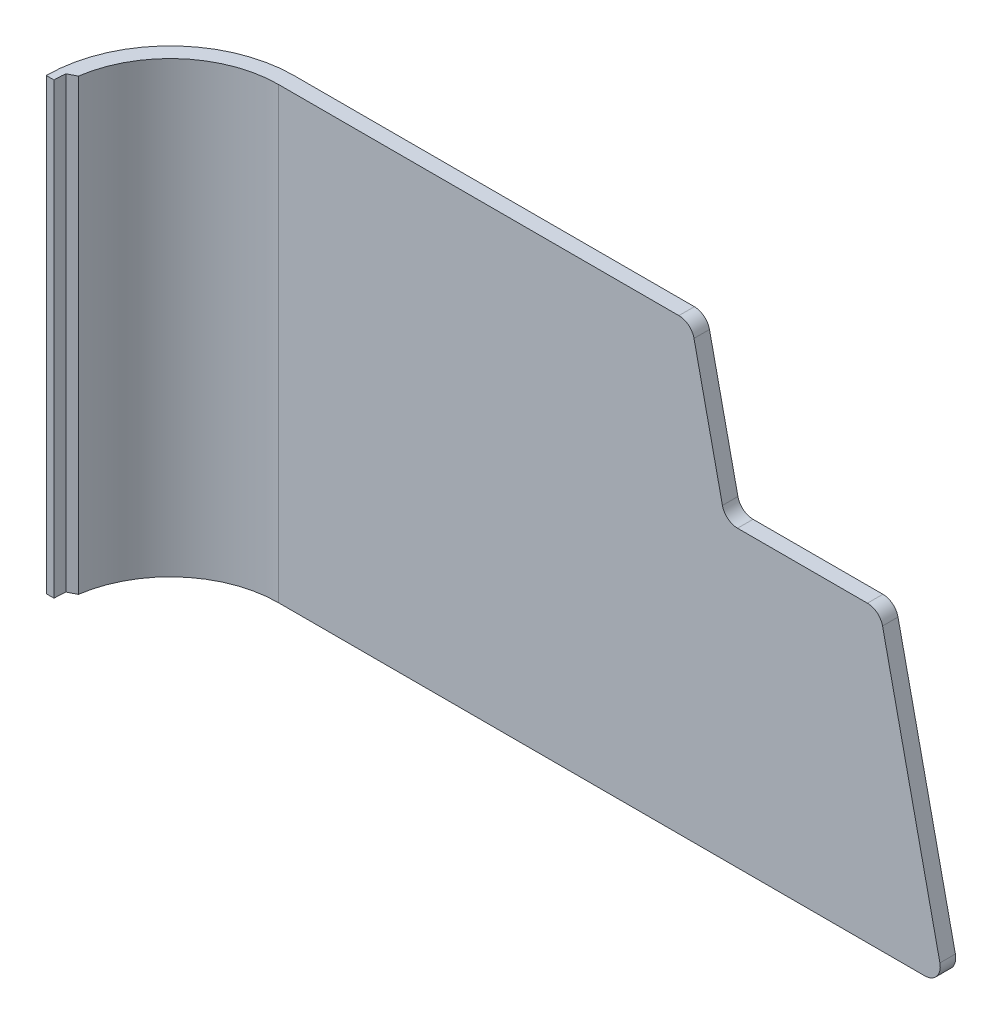
ISO-10303-21;
HEADER;
FILE_DESCRIPTION(('STEP AP214'),'2;1');
FILE_NAME('part.step','',(''),(''),'','','');
FILE_SCHEMA(('AUTOMOTIVE_DESIGN { 1 0 10303 214 1 1 1 1 }'));
ENDSEC;
DATA;
#1=APPLICATION_CONTEXT('core data for automotive mechanical design processes');
#2=APPLICATION_PROTOCOL_DEFINITION('international standard','automotive_design',2000,#1);
#3=PRODUCT_CONTEXT('',#1,'mechanical');
#4=PRODUCT('Part','Part','',(#3));
#5=PRODUCT_RELATED_PRODUCT_CATEGORY('part','',(#4));
#6=PRODUCT_DEFINITION_FORMATION('','',#4);
#7=PRODUCT_DEFINITION_CONTEXT('part definition',#1,'design');
#8=PRODUCT_DEFINITION('design','',#6,#7);
#9=PRODUCT_DEFINITION_SHAPE('','',#8);
#10=(LENGTH_UNIT() NAMED_UNIT(*) SI_UNIT(.MILLI.,.METRE.));
#11=(NAMED_UNIT(*) PLANE_ANGLE_UNIT() SI_UNIT($,.RADIAN.));
#12=(NAMED_UNIT(*) SI_UNIT($,.STERADIAN.) SOLID_ANGLE_UNIT());
#13=UNCERTAINTY_MEASURE_WITH_UNIT(LENGTH_MEASURE(1.E-05),#10,'distance_accuracy_value','');
#14=(GEOMETRIC_REPRESENTATION_CONTEXT(3) GLOBAL_UNCERTAINTY_ASSIGNED_CONTEXT((#13)) GLOBAL_UNIT_ASSIGNED_CONTEXT((#10,
#11,#12)) REPRESENTATION_CONTEXT('',''));
#15=CARTESIAN_POINT('',(0.,0.,0.));
#16=DIRECTION('',(0.,0.,1.));
#17=DIRECTION('',(1.,0.,0.));
#18=AXIS2_PLACEMENT_3D('',#15,#16,#17);
#19=CARTESIAN_POINT('',(-50.,58.,-16.));
#20=DIRECTION('',(0.,0.,-1.));
#21=DIRECTION('',(-1.,0.,0.));
#22=AXIS2_PLACEMENT_3D('',#19,#20,#21);
#23=PLANE('',#22);
#24=DIRECTION('',(-0.213030386274981,0.977045574435263,0.));
#25=VECTOR('',#24,1.);
#26=CARTESIAN_POINT('',(34.3662499628471,7.49305426068737,-16.));
#27=LINE('',#26,#25);
#28=CARTESIAN_POINT('',(35.4710332076355,2.42606077254996,-16.));
#29=VERTEX_POINT('',#28);
#30=CARTESIAN_POINT('',(28.0578343529804,36.42606077255,-16.));
#31=VERTEX_POINT('',#30);
#32=EDGE_CURVE('E180',#29,#31,#27,.T.);
#33=ORIENTED_EDGE('',*,*,#32,.F.);
#34=CARTESIAN_POINT('',(33.516942058765,2.,-16.));
#35=DIRECTION('',(0.,0.,-1.));
#36=DIRECTION('',(-1.,0.,0.));
#37=AXIS2_PLACEMENT_3D('',#34,#35,#36);
#38=CIRCLE('',#37,2.);
#39=CARTESIAN_POINT('',(33.516942058765,0.,-16.));
#40=VERTEX_POINT('',#39);
#41=EDGE_CURVE('E221',#29,#40,#38,.T.);
#42=ORIENTED_EDGE('',*,*,#41,.T.);
#43=DIRECTION('',(1.,0.,0.));
#44=VECTOR('',#43,1.);
#45=CARTESIAN_POINT('',(-50.,0.,-16.));
#46=LINE('',#45,#44);
#47=CARTESIAN_POINT('',(-50.,0.,-16.));
#48=VERTEX_POINT('',#47);
#49=EDGE_CURVE('E176',#48,#40,#46,.T.);
#50=ORIENTED_EDGE('',*,*,#49,.F.);
#51=DIRECTION('',(0.,-1.,0.));
#52=VECTOR('',#51,1.);
#53=CARTESIAN_POINT('',(-50.,58.,-16.));
#54=LINE('',#53,#52);
#55=CARTESIAN_POINT('',(-50.,58.,-16.));
#56=VERTEX_POINT('',#55);
#57=EDGE_CURVE('E194',#56,#48,#54,.T.);
#58=ORIENTED_EDGE('',*,*,#57,.F.);
#59=DIRECTION('',(1.,0.,0.));
#60=VECTOR('',#59,1.);
#61=CARTESIAN_POINT('',(-50.,58.,-16.));
#62=LINE('',#61,#60);
#63=CARTESIAN_POINT('',(1.74303799548921,58.,-16.));
#64=VERTEX_POINT('',#63);
#65=EDGE_CURVE('E159',#56,#64,#62,.T.);
#66=ORIENTED_EDGE('',*,*,#65,.T.);
#67=CARTESIAN_POINT('',(1.74303799548922,56.,-16.));
#68=DIRECTION('',(0.,0.,-1.));
#69=DIRECTION('',(-1.,0.,0.));
#70=AXIS2_PLACEMENT_3D('',#67,#68,#69);
#71=CIRCLE('',#70,2.);
#72=CARTESIAN_POINT('',(3.69712914435974,56.42606077255,-16.));
#73=VERTEX_POINT('',#72);
#74=EDGE_CURVE('E217',#64,#73,#71,.T.);
#75=ORIENTED_EDGE('',*,*,#74,.T.);
#76=DIRECTION('',(-0.213030386274981,0.977045574435263,0.));
#77=VECTOR('',#76,1.);
#78=CARTESIAN_POINT('',(15.2738888723765,3.33024633808327,-16.));
#79=LINE('',#78,#77);
#80=CARTESIAN_POINT('',(7.37148585426103,39.5739392274501,-16.));
#81=VERTEX_POINT('',#80);
#82=EDGE_CURVE('E249',#81,#73,#79,.T.);
#83=ORIENTED_EDGE('',*,*,#82,.F.);
#84=CARTESIAN_POINT('',(9.32557700313156,40.,-16.));
#85=DIRECTION('',(0.,0.,-1.));
#86=DIRECTION('',(-1.,0.,0.));
#87=AXIS2_PLACEMENT_3D('',#84,#85,#86);
#88=CIRCLE('',#87,2.);
#89=CARTESIAN_POINT('',(9.32557700313156,38.,-16.));
#90=VERTEX_POINT('',#89);
#91=EDGE_CURVE('E11',#81,#90,#88,.F.);
#92=ORIENTED_EDGE('',*,*,#91,.T.);
#93=DIRECTION('',(-1.,0.,0.));
#94=VECTOR('',#93,1.);
#95=CARTESIAN_POINT('',(0.,38.,-16.));
#96=LINE('',#95,#94);
#97=CARTESIAN_POINT('',(26.1037432041099,38.,-16.));
#98=VERTEX_POINT('',#97);
#99=EDGE_CURVE('E247',#98,#90,#96,.T.);
#100=ORIENTED_EDGE('',*,*,#99,.F.);
#101=CARTESIAN_POINT('',(26.1037432041099,36.,-16.));
#102=DIRECTION('',(0.,0.,-1.));
#103=DIRECTION('',(-1.,0.,0.));
#104=AXIS2_PLACEMENT_3D('',#101,#102,#103);
#105=CIRCLE('',#104,2.);
#106=EDGE_CURVE('E219',#98,#31,#105,.T.);
#107=ORIENTED_EDGE('',*,*,#106,.T.);
#108=EDGE_LOOP('',(#33,#42,#50,#58,#66,#75,#83,#92,#100,#107));
#109=FACE_BOUND('',#108,.T.);
#110=ADVANCED_FACE('F38',(#109),#23,.T.);
#111=CARTESIAN_POINT('',(-50.,58.,-14.));
#112=DIRECTION('',(0.,0.,-1.));
#113=DIRECTION('',(-1.,0.,0.));
#114=AXIS2_PLACEMENT_3D('',#111,#112,#113);
#115=PLANE('',#114);
#116=DIRECTION('',(1.,0.,0.));
#117=VECTOR('',#116,1.);
#118=CARTESIAN_POINT('',(-50.,0.,-14.));
#119=LINE('',#118,#117);
#120=CARTESIAN_POINT('',(-50.,0.,-14.));
#121=VERTEX_POINT('',#120);
#122=CARTESIAN_POINT('',(33.516942058765,0.,-14.));
#123=VERTEX_POINT('',#122);
#124=EDGE_CURVE('E179',#121,#123,#119,.T.);
#125=ORIENTED_EDGE('',*,*,#124,.T.);
#126=CARTESIAN_POINT('',(33.516942058765,2.,-14.));
#127=DIRECTION('',(0.,0.,-1.));
#128=DIRECTION('',(-1.,0.,0.));
#129=AXIS2_PLACEMENT_3D('',#126,#127,#128);
#130=CIRCLE('',#129,2.);
#131=CARTESIAN_POINT('',(35.4710332076355,2.42606077254996,-14.));
#132=VERTEX_POINT('',#131);
#133=EDGE_CURVE('E210',#123,#132,#130,.F.);
#134=ORIENTED_EDGE('',*,*,#133,.T.);
#135=DIRECTION('',(-0.213030386274981,0.977045574435263,0.));
#136=VECTOR('',#135,1.);
#137=CARTESIAN_POINT('',(34.3662499628471,7.49305426068737,-14.));
#138=LINE('',#137,#136);
#139=CARTESIAN_POINT('',(28.0578343529804,36.42606077255,-14.));
#140=VERTEX_POINT('',#139);
#141=EDGE_CURVE('E253',#132,#140,#138,.T.);
#142=ORIENTED_EDGE('',*,*,#141,.T.);
#143=CARTESIAN_POINT('',(26.1037432041099,36.,-14.));
#144=DIRECTION('',(0.,0.,-1.));
#145=DIRECTION('',(-1.,0.,0.));
#146=AXIS2_PLACEMENT_3D('',#143,#144,#145);
#147=CIRCLE('',#146,2.);
#148=CARTESIAN_POINT('',(26.1037432041099,38.,-14.));
#149=VERTEX_POINT('',#148);
#150=EDGE_CURVE('E208',#140,#149,#147,.F.);
#151=ORIENTED_EDGE('',*,*,#150,.T.);
#152=DIRECTION('',(-1.,0.,0.));
#153=VECTOR('',#152,1.);
#154=CARTESIAN_POINT('',(0.,38.,-14.));
#155=LINE('',#154,#153);
#156=CARTESIAN_POINT('',(9.32557700313156,38.,-14.));
#157=VERTEX_POINT('',#156);
#158=EDGE_CURVE('E236',#149,#157,#155,.T.);
#159=ORIENTED_EDGE('',*,*,#158,.T.);
#160=CARTESIAN_POINT('',(9.32557700313156,40.,-14.));
#161=DIRECTION('',(0.,0.,-1.));
#162=DIRECTION('',(-1.,0.,0.));
#163=AXIS2_PLACEMENT_3D('',#160,#161,#162);
#164=CIRCLE('',#163,2.);
#165=CARTESIAN_POINT('',(7.37148585426103,39.5739392274501,-14.));
#166=VERTEX_POINT('',#165);
#167=EDGE_CURVE('E46',#157,#166,#164,.T.);
#168=ORIENTED_EDGE('',*,*,#167,.T.);
#169=DIRECTION('',(-0.213030386274981,0.977045574435263,0.));
#170=VECTOR('',#169,1.);
#171=CARTESIAN_POINT('',(15.2738888723765,3.33024633808327,-14.));
#172=LINE('',#171,#170);
#173=CARTESIAN_POINT('',(3.69712914435974,56.42606077255,-14.));
#174=VERTEX_POINT('',#173);
#175=EDGE_CURVE('E235',#166,#174,#172,.T.);
#176=ORIENTED_EDGE('',*,*,#175,.T.);
#177=CARTESIAN_POINT('',(1.74303799548922,56.,-14.));
#178=DIRECTION('',(0.,0.,-1.));
#179=DIRECTION('',(-1.,0.,0.));
#180=AXIS2_PLACEMENT_3D('',#177,#178,#179);
#181=CIRCLE('',#180,2.);
#182=CARTESIAN_POINT('',(1.74303799548921,58.,-14.));
#183=VERTEX_POINT('',#182);
#184=EDGE_CURVE('E156',#174,#183,#181,.F.);
#185=ORIENTED_EDGE('',*,*,#184,.T.);
#186=DIRECTION('',(1.,0.,0.));
#187=VECTOR('',#186,1.);
#188=CARTESIAN_POINT('',(-50.,58.,-14.));
#189=LINE('',#188,#187);
#190=CARTESIAN_POINT('',(-50.,58.,-14.));
#191=VERTEX_POINT('',#190);
#192=EDGE_CURVE('E153',#191,#183,#189,.T.);
#193=ORIENTED_EDGE('',*,*,#192,.F.);
#194=DIRECTION('',(0.,-1.,0.));
#195=VECTOR('',#194,1.);
#196=CARTESIAN_POINT('',(-50.,58.,-14.));
#197=LINE('',#196,#195);
#198=EDGE_CURVE('E139',#191,#121,#197,.T.);
#199=ORIENTED_EDGE('',*,*,#198,.T.);
#200=EDGE_LOOP('',(#125,#134,#142,#151,#159,#168,#176,#185,#193,#199));
#201=FACE_BOUND('',#200,.T.);
#202=ADVANCED_FACE('F154',(#201),#115,.F.);
#203=CARTESIAN_POINT('',(-50.,58.,0.));
#204=DIRECTION('',(0.,1.,0.));
#205=DIRECTION('',(0.,0.,1.));
#206=AXIS2_PLACEMENT_3D('',#203,#204,#205);
#207=PLANE('',#206);
#208=ORIENTED_EDGE('',*,*,#192,.T.);
#209=DIRECTION('',(0.,0.,1.));
#210=VECTOR('',#209,1.);
#211=CARTESIAN_POINT('',(1.74303799548921,58.,0.));
#212=LINE('',#211,#210);
#213=EDGE_CURVE('E232',#183,#64,#212,.F.);
#214=ORIENTED_EDGE('',*,*,#213,.T.);
#215=ORIENTED_EDGE('',*,*,#65,.F.);
#216=CARTESIAN_POINT('',(-50.,58.,0.));
#217=DIRECTION('',(0.,1.,0.));
#218=DIRECTION('',(0.,0.,1.));
#219=AXIS2_PLACEMENT_3D('',#216,#217,#218);
#220=CIRCLE('',#219,16.);
#221=CARTESIAN_POINT('',(-66.,58.,0.));
#222=VERTEX_POINT('',#221);
#223=EDGE_CURVE('E150',#56,#222,#220,.T.);
#224=ORIENTED_EDGE('',*,*,#223,.T.);
#225=DIRECTION('',(1.,0.,0.));
#226=VECTOR('',#225,1.);
#227=CARTESIAN_POINT('',(-66.,58.,0.));
#228=LINE('',#227,#226);
#229=CARTESIAN_POINT('',(-65.,58.,0.));
#230=VERTEX_POINT('',#229);
#231=EDGE_CURVE('E173',#222,#230,#228,.T.);
#232=ORIENTED_EDGE('',*,*,#231,.T.);
#233=CARTESIAN_POINT('',(-50.,58.,0.));
#234=DIRECTION('',(0.,1.,0.));
#235=DIRECTION('',(0.,0.,1.));
#236=AXIS2_PLACEMENT_3D('',#233,#234,#235);
#237=CIRCLE('',#236,15.);
#238=CARTESIAN_POINT('',(-64.928657628904,58.,-1.46122599175011));
#239=VERTEX_POINT('',#238);
#240=EDGE_CURVE('E167',#239,#230,#237,.T.);
#241=ORIENTED_EDGE('',*,*,#240,.F.);
#242=DIRECTION('',(0.893542640294161,0.,-0.448978340208234));
#243=VECTOR('',#242,1.);
#244=CARTESIAN_POINT('',(-64.928657628904,58.,-1.4612259917501));
#245=LINE('',#244,#243);
#246=CARTESIAN_POINT('',(-63.856406460551,58.,-1.99999999999998));
#247=VERTEX_POINT('',#246);
#248=EDGE_CURVE('E164',#239,#247,#245,.T.);
#249=ORIENTED_EDGE('',*,*,#248,.T.);
#250=CARTESIAN_POINT('',(-50.,58.,0.));
#251=DIRECTION('',(0.,1.,0.));
#252=DIRECTION('',(0.,0.,1.));
#253=AXIS2_PLACEMENT_3D('',#250,#251,#252);
#254=CIRCLE('',#253,14.);
#255=EDGE_CURVE('E143',#191,#247,#254,.T.);
#256=ORIENTED_EDGE('',*,*,#255,.F.);
#257=EDGE_LOOP('',(#208,#214,#215,#224,#232,#241,#249,#256));
#258=FACE_BOUND('',#257,.T.);
#259=ADVANCED_FACE('F161',(#258),#207,.T.);
#260=CARTESIAN_POINT('',(-50.,58.,0.));
#261=DIRECTION('',(0.,-1.,0.));
#262=DIRECTION('',(0.,0.,-1.));
#263=AXIS2_PLACEMENT_3D('',#260,#261,#262);
#264=CYLINDRICAL_SURFACE('',#263,16.);
#265=CARTESIAN_POINT('',(-50.,0.,0.));
#266=DIRECTION('',(0.,1.,0.));
#267=DIRECTION('',(0.,0.,1.));
#268=AXIS2_PLACEMENT_3D('',#265,#266,#267);
#269=CIRCLE('',#268,16.);
#270=CARTESIAN_POINT('',(-66.,0.,0.));
#271=VERTEX_POINT('',#270);
#272=EDGE_CURVE('E192',#48,#271,#269,.T.);
#273=ORIENTED_EDGE('',*,*,#272,.T.);
#274=DIRECTION('',(0.,-1.,0.));
#275=VECTOR('',#274,1.);
#276=CARTESIAN_POINT('',(-66.,58.,0.));
#277=LINE('',#276,#275);
#278=EDGE_CURVE('E197',#222,#271,#277,.T.);
#279=ORIENTED_EDGE('',*,*,#278,.F.);
#280=ORIENTED_EDGE('',*,*,#223,.F.);
#281=ORIENTED_EDGE('',*,*,#57,.T.);
#282=EDGE_LOOP('',(#273,#279,#280,#281));
#283=FACE_BOUND('',#282,.T.);
#284=ADVANCED_FACE('F299',(#283),#264,.T.);
#285=CARTESIAN_POINT('',(-66.,58.,0.));
#286=DIRECTION('',(0.,0.,-1.));
#287=DIRECTION('',(-1.,0.,0.));
#288=AXIS2_PLACEMENT_3D('',#285,#286,#287);
#289=PLANE('',#288);
#290=DIRECTION('',(1.,0.,0.));
#291=VECTOR('',#290,1.);
#292=CARTESIAN_POINT('',(-66.,0.,0.));
#293=LINE('',#292,#291);
#294=CARTESIAN_POINT('',(-65.,0.,0.));
#295=VERTEX_POINT('',#294);
#296=EDGE_CURVE('E189',#271,#295,#293,.T.);
#297=ORIENTED_EDGE('',*,*,#296,.T.);
#298=DIRECTION('',(0.,-1.,0.));
#299=VECTOR('',#298,1.);
#300=CARTESIAN_POINT('',(-65.,58.,0.));
#301=LINE('',#300,#299);
#302=EDGE_CURVE('E200',#230,#295,#301,.T.);
#303=ORIENTED_EDGE('',*,*,#302,.F.);
#304=ORIENTED_EDGE('',*,*,#231,.F.);
#305=ORIENTED_EDGE('',*,*,#278,.T.);
#306=EDGE_LOOP('',(#297,#303,#304,#305));
#307=FACE_BOUND('',#306,.T.);
#308=ADVANCED_FACE('F302',(#307),#289,.F.);
#309=CARTESIAN_POINT('',(-50.,58.,0.));
#310=DIRECTION('',(0.,-1.,0.));
#311=DIRECTION('',(0.,0.,-1.));
#312=AXIS2_PLACEMENT_3D('',#309,#310,#311);
#313=CYLINDRICAL_SURFACE('',#312,15.);
#314=CARTESIAN_POINT('',(-50.,0.,0.));
#315=DIRECTION('',(0.,1.,0.));
#316=DIRECTION('',(0.,0.,1.));
#317=AXIS2_PLACEMENT_3D('',#314,#315,#316);
#318=CIRCLE('',#317,15.);
#319=CARTESIAN_POINT('',(-64.928657628904,0.,-1.46122599175011));
#320=VERTEX_POINT('',#319);
#321=EDGE_CURVE('E186',#320,#295,#318,.T.);
#322=ORIENTED_EDGE('',*,*,#321,.F.);
#323=DIRECTION('',(0.,-1.,0.));
#324=VECTOR('',#323,1.);
#325=CARTESIAN_POINT('',(-64.928657628904,58.,-1.46122599175011));
#326=LINE('',#325,#324);
#327=EDGE_CURVE('E202',#239,#320,#326,.T.);
#328=ORIENTED_EDGE('',*,*,#327,.F.);
#329=ORIENTED_EDGE('',*,*,#240,.T.);
#330=ORIENTED_EDGE('',*,*,#302,.T.);
#331=EDGE_LOOP('',(#322,#328,#329,#330));
#332=FACE_BOUND('',#331,.T.);
#333=ADVANCED_FACE('F306',(#332),#313,.F.);
#334=CARTESIAN_POINT('',(-64.928657628904,58.,-1.4612259917501));
#335=DIRECTION('',(-0.448978340208234,0.,-0.893542640294161));
#336=DIRECTION('',(-0.893542640294161,0.,0.448978340208234));
#337=AXIS2_PLACEMENT_3D('',#334,#335,#336);
#338=PLANE('',#337);
#339=DIRECTION('',(0.893542640294161,0.,-0.448978340208234));
#340=VECTOR('',#339,1.);
#341=CARTESIAN_POINT('',(-64.928657628904,0.,-1.4612259917501));
#342=LINE('',#341,#340);
#343=CARTESIAN_POINT('',(-63.856406460551,0.,-1.99999999999998));
#344=VERTEX_POINT('',#343);
#345=EDGE_CURVE('E183',#320,#344,#342,.T.);
#346=ORIENTED_EDGE('',*,*,#345,.T.);
#347=DIRECTION('',(0.,-1.,0.));
#348=VECTOR('',#347,1.);
#349=CARTESIAN_POINT('',(-63.856406460551,58.,-1.99999999999998));
#350=LINE('',#349,#348);
#351=EDGE_CURVE('E149',#247,#344,#350,.T.);
#352=ORIENTED_EDGE('',*,*,#351,.F.);
#353=ORIENTED_EDGE('',*,*,#248,.F.);
#354=ORIENTED_EDGE('',*,*,#327,.T.);
#355=EDGE_LOOP('',(#346,#352,#353,#354));
#356=FACE_BOUND('',#355,.T.);
#357=ADVANCED_FACE('F309',(#356),#338,.F.);
#358=CARTESIAN_POINT('',(-50.,58.,0.));
#359=DIRECTION('',(0.,-1.,0.));
#360=DIRECTION('',(0.,0.,-1.));
#361=AXIS2_PLACEMENT_3D('',#358,#359,#360);
#362=CYLINDRICAL_SURFACE('',#361,14.);
#363=CARTESIAN_POINT('',(-50.,0.,0.));
#364=DIRECTION('',(0.,1.,0.));
#365=DIRECTION('',(0.,0.,1.));
#366=AXIS2_PLACEMENT_3D('',#363,#364,#365);
#367=CIRCLE('',#366,14.);
#368=EDGE_CURVE('E145',#121,#344,#367,.T.);
#369=ORIENTED_EDGE('',*,*,#368,.F.);
#370=ORIENTED_EDGE('',*,*,#198,.F.);
#371=ORIENTED_EDGE('',*,*,#255,.T.);
#372=ORIENTED_EDGE('',*,*,#351,.T.);
#373=EDGE_LOOP('',(#369,#370,#371,#372));
#374=FACE_BOUND('',#373,.T.);
#375=ADVANCED_FACE('F141',(#374),#362,.F.);
#376=CARTESIAN_POINT('',(-50.,0.,0.));
#377=DIRECTION('',(0.,1.,0.));
#378=DIRECTION('',(0.,0.,1.));
#379=AXIS2_PLACEMENT_3D('',#376,#377,#378);
#380=PLANE('',#379);
#381=ORIENTED_EDGE('',*,*,#49,.T.);
#382=DIRECTION('',(0.,0.,1.));
#383=VECTOR('',#382,1.);
#384=CARTESIAN_POINT('',(33.516942058765,0.,-14.));
#385=LINE('',#384,#383);
#386=EDGE_CURVE('E196',#40,#123,#385,.T.);
#387=ORIENTED_EDGE('',*,*,#386,.T.);
#388=ORIENTED_EDGE('',*,*,#124,.F.);
#389=ORIENTED_EDGE('',*,*,#368,.T.);
#390=ORIENTED_EDGE('',*,*,#345,.F.);
#391=ORIENTED_EDGE('',*,*,#321,.T.);
#392=ORIENTED_EDGE('',*,*,#296,.F.);
#393=ORIENTED_EDGE('',*,*,#272,.F.);
#394=EDGE_LOOP('',(#381,#387,#388,#389,#390,#391,#392,#393));
#395=FACE_BOUND('',#394,.T.);
#396=ADVANCED_FACE('F295',(#395),#380,.F.);
#397=CARTESIAN_POINT('',(15.2738888723765,3.33024633808327,-16.));
#398=DIRECTION('',(0.977045574435263,0.213030386274981,0.));
#399=DIRECTION('',(-0.213030386274981,0.977045574435263,0.));
#400=AXIS2_PLACEMENT_3D('',#397,#398,#399);
#401=PLANE('',#400);
#402=ORIENTED_EDGE('',*,*,#175,.F.);
#403=DIRECTION('',(0.,0.,1.));
#404=VECTOR('',#403,1.);
#405=CARTESIAN_POINT('',(7.37148585426103,39.57393922745,-16.));
#406=LINE('',#405,#404);
#407=EDGE_CURVE('E230',#166,#81,#406,.F.);
#408=ORIENTED_EDGE('',*,*,#407,.T.);
#409=ORIENTED_EDGE('',*,*,#82,.T.);
#410=DIRECTION('',(0.,0.,1.));
#411=VECTOR('',#410,1.);
#412=CARTESIAN_POINT('',(3.69712914435974,56.42606077255,-16.));
#413=LINE('',#412,#411);
#414=EDGE_CURVE('E227',#73,#174,#413,.T.);
#415=ORIENTED_EDGE('',*,*,#414,.T.);
#416=EDGE_LOOP('',(#402,#408,#409,#415));
#417=FACE_BOUND('',#416,.T.);
#418=ADVANCED_FACE('F241',(#417),#401,.T.);
#419=CARTESIAN_POINT('',(34.3662499628471,7.49305426068737,-16.));
#420=DIRECTION('',(0.977045574435263,0.213030386274981,0.));
#421=DIRECTION('',(-0.213030386274981,0.977045574435263,0.));
#422=AXIS2_PLACEMENT_3D('',#419,#420,#421);
#423=PLANE('',#422);
#424=ORIENTED_EDGE('',*,*,#141,.F.);
#425=DIRECTION('',(0.,0.,1.));
#426=VECTOR('',#425,1.);
#427=CARTESIAN_POINT('',(35.4710332076355,2.42606077254996,-16.));
#428=LINE('',#427,#426);
#429=EDGE_CURVE('E215',#132,#29,#428,.F.);
#430=ORIENTED_EDGE('',*,*,#429,.T.);
#431=ORIENTED_EDGE('',*,*,#32,.T.);
#432=DIRECTION('',(0.,0.,1.));
#433=VECTOR('',#432,1.);
#434=CARTESIAN_POINT('',(28.0578343529804,36.42606077255,-16.));
#435=LINE('',#434,#433);
#436=EDGE_CURVE('E212',#31,#140,#435,.T.);
#437=ORIENTED_EDGE('',*,*,#436,.T.);
#438=EDGE_LOOP('',(#424,#430,#431,#437));
#439=FACE_BOUND('',#438,.T.);
#440=ADVANCED_FACE('F290',(#439),#423,.T.);
#441=CARTESIAN_POINT('',(0.,38.,-16.));
#442=DIRECTION('',(0.,1.,0.));
#443=DIRECTION('',(-1.,0.,0.));
#444=AXIS2_PLACEMENT_3D('',#441,#442,#443);
#445=PLANE('',#444);
#446=ORIENTED_EDGE('',*,*,#158,.F.);
#447=DIRECTION('',(0.,0.,1.));
#448=VECTOR('',#447,1.);
#449=CARTESIAN_POINT('',(26.1037432041099,38.,-16.));
#450=LINE('',#449,#448);
#451=EDGE_CURVE('E58',#149,#98,#450,.F.);
#452=ORIENTED_EDGE('',*,*,#451,.T.);
#453=ORIENTED_EDGE('',*,*,#99,.T.);
#454=DIRECTION('',(0.,0.,1.));
#455=VECTOR('',#454,1.);
#456=CARTESIAN_POINT('',(9.32557700313156,38.,-14.));
#457=LINE('',#456,#455);
#458=EDGE_CURVE('E223',#90,#157,#457,.T.);
#459=ORIENTED_EDGE('',*,*,#458,.T.);
#460=EDGE_LOOP('',(#446,#452,#453,#459));
#461=FACE_BOUND('',#460,.T.);
#462=ADVANCED_FACE('F246',(#461),#445,.T.);
#463=CARTESIAN_POINT('',(33.516942058765,2.,0.));
#464=DIRECTION('',(0.,0.,-1.));
#465=DIRECTION('',(-1.,0.,0.));
#466=AXIS2_PLACEMENT_3D('',#463,#464,#465);
#467=CYLINDRICAL_SURFACE('',#466,2.);
#468=ORIENTED_EDGE('',*,*,#41,.F.);
#469=ORIENTED_EDGE('',*,*,#429,.F.);
#470=ORIENTED_EDGE('',*,*,#133,.F.);
#471=ORIENTED_EDGE('',*,*,#386,.F.);
#472=EDGE_LOOP('',(#468,#469,#470,#471));
#473=FACE_BOUND('',#472,.T.);
#474=ADVANCED_FACE('F278',(#473),#467,.T.);
#475=CARTESIAN_POINT('',(26.1037432041099,36.,-16.));
#476=DIRECTION('',(0.,0.,1.));
#477=DIRECTION('',(1.,0.,0.));
#478=AXIS2_PLACEMENT_3D('',#475,#476,#477);
#479=CYLINDRICAL_SURFACE('',#478,2.);
#480=ORIENTED_EDGE('',*,*,#106,.F.);
#481=ORIENTED_EDGE('',*,*,#451,.F.);
#482=ORIENTED_EDGE('',*,*,#150,.F.);
#483=ORIENTED_EDGE('',*,*,#436,.F.);
#484=EDGE_LOOP('',(#480,#481,#482,#483));
#485=FACE_BOUND('',#484,.T.);
#486=ADVANCED_FACE('F269',(#485),#479,.T.);
#487=CARTESIAN_POINT('',(9.32557700313156,40.,-16.));
#488=DIRECTION('',(0.,0.,-1.));
#489=DIRECTION('',(-1.,0.,0.));
#490=AXIS2_PLACEMENT_3D('',#487,#488,#489);
#491=CYLINDRICAL_SURFACE('',#490,2.);
#492=ORIENTED_EDGE('',*,*,#91,.F.);
#493=ORIENTED_EDGE('',*,*,#407,.F.);
#494=ORIENTED_EDGE('',*,*,#167,.F.);
#495=ORIENTED_EDGE('',*,*,#458,.F.);
#496=EDGE_LOOP('',(#492,#493,#494,#495));
#497=FACE_BOUND('',#496,.T.);
#498=ADVANCED_FACE('F245',(#497),#491,.F.);
#499=CARTESIAN_POINT('',(1.74303799548922,56.,-16.));
#500=DIRECTION('',(0.,0.,1.));
#501=DIRECTION('',(1.,0.,0.));
#502=AXIS2_PLACEMENT_3D('',#499,#500,#501);
#503=CYLINDRICAL_SURFACE('',#502,2.);
#504=ORIENTED_EDGE('',*,*,#74,.F.);
#505=ORIENTED_EDGE('',*,*,#213,.F.);
#506=ORIENTED_EDGE('',*,*,#184,.F.);
#507=ORIENTED_EDGE('',*,*,#414,.F.);
#508=EDGE_LOOP('',(#504,#505,#506,#507));
#509=FACE_BOUND('',#508,.T.);
#510=ADVANCED_FACE('F40',(#509),#503,.T.);
#511=CLOSED_SHELL('',(#110,#202,#259,#284,#308,#333,#357,#375,#396,#418,#440,#462,#474,#486,
#498,#510));
#512=MANIFOLD_SOLID_BREP('B2',#511);
#513=ADVANCED_BREP_SHAPE_REPRESENTATION('',(#18,#512),#14);
#514=SHAPE_DEFINITION_REPRESENTATION(#9,#513);
ENDSEC;
END-ISO-10303-21;
